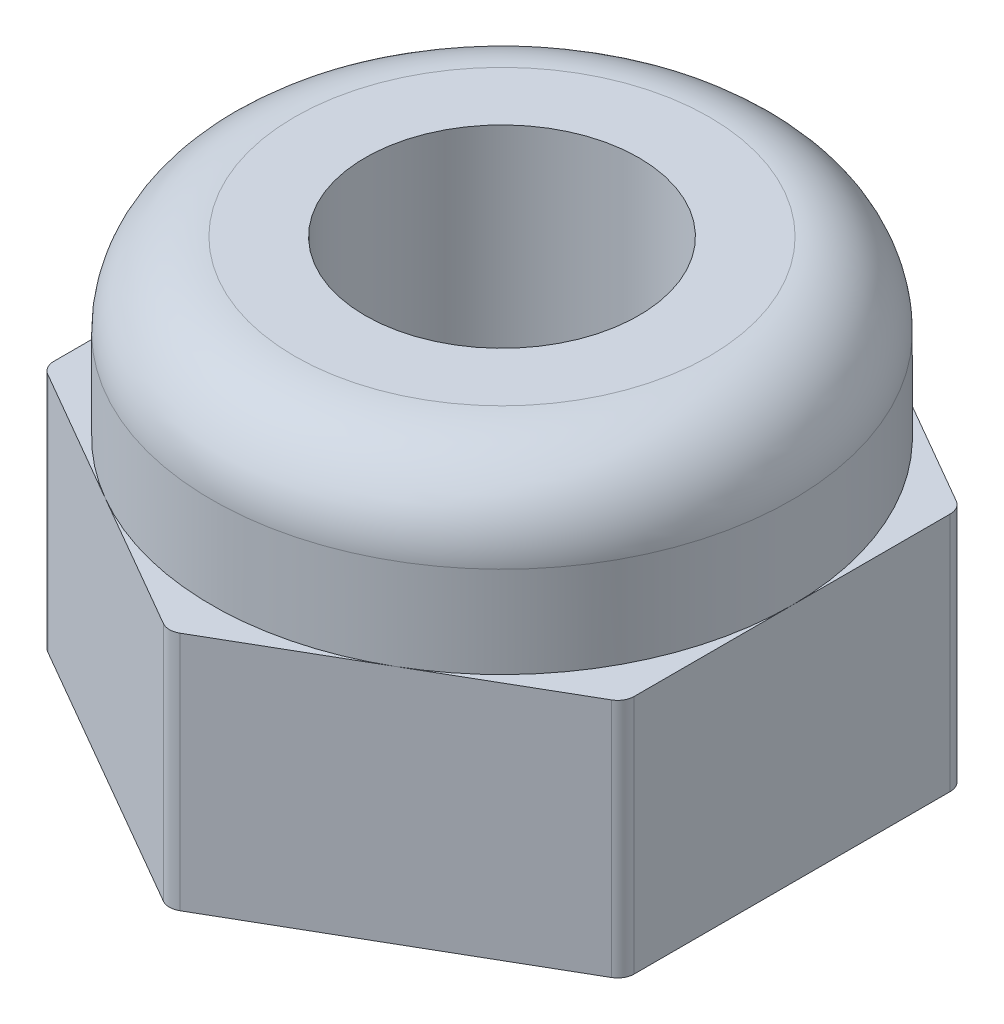
ISO-10303-21;
HEADER;
FILE_DESCRIPTION(('STEP AP214'),'2;1');
FILE_NAME('part.step','',(''),(''),'','','');
FILE_SCHEMA(('AUTOMOTIVE_DESIGN { 1 0 10303 214 1 1 1 1 }'));
ENDSEC;
DATA;
#1=APPLICATION_CONTEXT('core data for automotive mechanical design processes');
#2=APPLICATION_PROTOCOL_DEFINITION('international standard','automotive_design',2000,#1);
#3=PRODUCT_CONTEXT('',#1,'mechanical');
#4=PRODUCT('Part','Part','',(#3));
#5=PRODUCT_RELATED_PRODUCT_CATEGORY('part','',(#4));
#6=PRODUCT_DEFINITION_FORMATION('','',#4);
#7=PRODUCT_DEFINITION_CONTEXT('part definition',#1,'design');
#8=PRODUCT_DEFINITION('design','',#6,#7);
#9=PRODUCT_DEFINITION_SHAPE('','',#8);
#10=(LENGTH_UNIT() NAMED_UNIT(*) SI_UNIT(.MILLI.,.METRE.));
#11=(NAMED_UNIT(*) PLANE_ANGLE_UNIT() SI_UNIT($,.RADIAN.));
#12=(NAMED_UNIT(*) SI_UNIT($,.STERADIAN.) SOLID_ANGLE_UNIT());
#13=UNCERTAINTY_MEASURE_WITH_UNIT(LENGTH_MEASURE(1.E-05),#10,'distance_accuracy_value','');
#14=(GEOMETRIC_REPRESENTATION_CONTEXT(3) GLOBAL_UNCERTAINTY_ASSIGNED_CONTEXT((#13)) GLOBAL_UNIT_ASSIGNED_CONTEXT((#10,
#11,#12)) REPRESENTATION_CONTEXT('',''));
#15=CARTESIAN_POINT('',(0.,0.,0.));
#16=DIRECTION('',(0.,0.,1.));
#17=DIRECTION('',(1.,0.,0.));
#18=AXIS2_PLACEMENT_3D('',#15,#16,#17);
#19=CARTESIAN_POINT('',(0.,2.9,0.));
#20=DIRECTION('',(0.,1.,0.));
#21=DIRECTION('',(0.,0.,1.));
#22=AXIS2_PLACEMENT_3D('',#19,#20,#21);
#23=PLANE('',#22);
#24=DIRECTION('',(0.866025403784435,0.,-0.500000000000007));
#25=VECTOR('',#24,1.);
#26=CARTESIAN_POINT('',(0.,2.9,4.04145188432738));
#27=LINE('',#26,#25);
#28=CARTESIAN_POINT('',(1.75000000000002,2.9,3.03108891324552));
#29=VERTEX_POINT('',#28);
#30=CARTESIAN_POINT('',(3.40000000000002,2.9,2.07846096908262));
#31=VERTEX_POINT('',#30);
#32=EDGE_CURVE('E159',#29,#31,#27,.T.);
#33=ORIENTED_EDGE('',*,*,#32,.T.);
#34=CARTESIAN_POINT('',(3.30000000000002,2.9,1.90525588832574));
#35=DIRECTION('',(0.,1.,0.));
#36=DIRECTION('',(0.,0.,1.));
#37=AXIS2_PLACEMENT_3D('',#34,#35,#36);
#38=CIRCLE('',#37,0.2);
#39=CARTESIAN_POINT('',(3.50000000000002,2.9,1.90525588832573));
#40=VERTEX_POINT('',#39);
#41=EDGE_CURVE('E52',#31,#40,#38,.T.);
#42=ORIENTED_EDGE('',*,*,#41,.T.);
#43=DIRECTION('',(0.,0.,-1.));
#44=VECTOR('',#43,1.);
#45=CARTESIAN_POINT('',(3.50000000000002,2.9,2.02072594216366));
#46=LINE('',#45,#44);
#47=CARTESIAN_POINT('',(3.5,2.9,0.));
#48=VERTEX_POINT('',#47);
#49=EDGE_CURVE('E170',#40,#48,#46,.T.);
#50=ORIENTED_EDGE('',*,*,#49,.T.);
#51=CARTESIAN_POINT('',(0.,2.9,0.));
#52=DIRECTION('',(0.,1.,0.));
#53=DIRECTION('',(0.,0.,1.));
#54=AXIS2_PLACEMENT_3D('',#51,#52,#53);
#55=CIRCLE('',#54,3.50000000000002);
#56=EDGE_CURVE('E168',#29,#48,#55,.T.);
#57=ORIENTED_EDGE('',*,*,#56,.F.);
#58=EDGE_LOOP('',(#33,#42,#50,#57));
#59=FACE_BOUND('',#58,.T.);
#60=ADVANCED_FACE('F43',(#59),#23,.T.);
#61=CARTESIAN_POINT('',(3.49999999999998,2.9,-1.90525588832581));
#62=VERTEX_POINT('',#61);
#63=EDGE_CURVE('E158',#48,#62,#46,.T.);
#64=ORIENTED_EDGE('',*,*,#63,.T.);
#65=CARTESIAN_POINT('',(3.29999999999998,2.9,-1.90525588832581));
#66=DIRECTION('',(0.,1.,0.));
#67=DIRECTION('',(0.,0.,1.));
#68=AXIS2_PLACEMENT_3D('',#65,#66,#67);
#69=CIRCLE('',#68,0.2);
#70=CARTESIAN_POINT('',(3.39999999999998,2.9,-2.07846096908269));
#71=VERTEX_POINT('',#70);
#72=EDGE_CURVE('E302',#62,#71,#69,.T.);
#73=ORIENTED_EDGE('',*,*,#72,.T.);
#74=DIRECTION('',(-0.866025403784442,0.,-0.499999999999995));
#75=VECTOR('',#74,1.);
#76=CARTESIAN_POINT('',(3.49999999999998,2.9,-2.02072594216373));
#77=LINE('',#76,#75);
#78=CARTESIAN_POINT('',(1.74999999999999,2.9,-3.03108891324556));
#79=VERTEX_POINT('',#78);
#80=EDGE_CURVE('E193',#71,#79,#77,.T.);
#81=ORIENTED_EDGE('',*,*,#80,.T.);
#82=EDGE_CURVE('E176',#48,#79,#55,.T.);
#83=ORIENTED_EDGE('',*,*,#82,.F.);
#84=EDGE_LOOP('',(#64,#73,#81,#83));
#85=FACE_BOUND('',#84,.T.);
#86=ADVANCED_FACE('F366',(#85),#23,.T.);
#87=CARTESIAN_POINT('',(0.0999999999999994,2.9,-3.98371685740842));
#88=VERTEX_POINT('',#87);
#89=EDGE_CURVE('E197',#79,#88,#77,.T.);
#90=ORIENTED_EDGE('',*,*,#89,.T.);
#91=CARTESIAN_POINT('',(0.,2.9,-3.81051177665153));
#92=DIRECTION('',(0.,1.,0.));
#93=DIRECTION('',(0.,0.,1.));
#94=AXIS2_PLACEMENT_3D('',#91,#92,#93);
#95=CIRCLE('',#94,0.2);
#96=CARTESIAN_POINT('',(-0.0999999999999996,2.9,-3.98371685740842));
#97=VERTEX_POINT('',#96);
#98=EDGE_CURVE('E292',#88,#97,#95,.T.);
#99=ORIENTED_EDGE('',*,*,#98,.T.);
#100=DIRECTION('',(-0.866025403784438,0.,0.500000000000001));
#101=VECTOR('',#100,1.);
#102=CARTESIAN_POINT('',(0.,2.9,-4.04145188432738));
#103=LINE('',#102,#101);
#104=CARTESIAN_POINT('',(-1.75,2.9,-3.03108891324553));
#105=VERTEX_POINT('',#104);
#106=EDGE_CURVE('E198',#97,#105,#103,.T.);
#107=ORIENTED_EDGE('',*,*,#106,.T.);
#108=EDGE_CURVE('E374',#79,#105,#55,.T.);
#109=ORIENTED_EDGE('',*,*,#108,.F.);
#110=EDGE_LOOP('',(#90,#99,#107,#109));
#111=FACE_BOUND('',#110,.T.);
#112=ADVANCED_FACE('F390',(#111),#23,.T.);
#113=CARTESIAN_POINT('',(-3.40000000000001,2.9,-2.07846096908265));
#114=VERTEX_POINT('',#113);
#115=EDGE_CURVE('E196',#105,#114,#103,.T.);
#116=ORIENTED_EDGE('',*,*,#115,.T.);
#117=CARTESIAN_POINT('',(-3.30000000000001,2.9,-1.90525588832576));
#118=DIRECTION('',(0.,1.,0.));
#119=DIRECTION('',(0.,0.,1.));
#120=AXIS2_PLACEMENT_3D('',#117,#118,#119);
#121=CIRCLE('',#120,0.2);
#122=CARTESIAN_POINT('',(-3.50000000000001,2.9,-1.90525588832576));
#123=VERTEX_POINT('',#122);
#124=EDGE_CURVE('E282',#114,#123,#121,.T.);
#125=ORIENTED_EDGE('',*,*,#124,.T.);
#126=DIRECTION('',(0.,0.,1.));
#127=VECTOR('',#126,1.);
#128=CARTESIAN_POINT('',(-3.50000000000001,2.9,-2.02072594216368));
#129=LINE('',#128,#127);
#130=CARTESIAN_POINT('',(-3.5,2.9,0.));
#131=VERTEX_POINT('',#130);
#132=EDGE_CURVE('E202',#123,#131,#129,.T.);
#133=ORIENTED_EDGE('',*,*,#132,.T.);
#134=EDGE_CURVE('E187',#105,#131,#55,.T.);
#135=ORIENTED_EDGE('',*,*,#134,.F.);
#136=EDGE_LOOP('',(#116,#125,#133,#135));
#137=FACE_BOUND('',#136,.T.);
#138=ADVANCED_FACE('F380',(#137),#23,.T.);
#139=CARTESIAN_POINT('',(-3.49999999999999,2.9,1.90525588832578));
#140=VERTEX_POINT('',#139);
#141=EDGE_CURVE('E201',#131,#140,#129,.T.);
#142=ORIENTED_EDGE('',*,*,#141,.T.);
#143=CARTESIAN_POINT('',(-3.29999999999999,2.9,1.90525588832578));
#144=DIRECTION('',(0.,1.,0.));
#145=DIRECTION('',(0.,0.,1.));
#146=AXIS2_PLACEMENT_3D('',#143,#144,#145);
#147=CIRCLE('',#146,0.2);
#148=CARTESIAN_POINT('',(-3.39999999999999,2.9,2.07846096908267));
#149=VERTEX_POINT('',#148);
#150=EDGE_CURVE('E272',#140,#149,#147,.T.);
#151=ORIENTED_EDGE('',*,*,#150,.T.);
#152=DIRECTION('',(0.866025403784442,0.,0.499999999999995));
#153=VECTOR('',#152,1.);
#154=CARTESIAN_POINT('',(-3.49999999999999,2.9,2.02072594216371));
#155=LINE('',#154,#153);
#156=CARTESIAN_POINT('',(-1.74999999999998,2.9,3.03108891324554));
#157=VERTEX_POINT('',#156);
#158=EDGE_CURVE('E166',#149,#157,#155,.T.);
#159=ORIENTED_EDGE('',*,*,#158,.T.);
#160=EDGE_CURVE('E182',#131,#157,#55,.T.);
#161=ORIENTED_EDGE('',*,*,#160,.F.);
#162=EDGE_LOOP('',(#142,#151,#159,#161));
#163=FACE_BOUND('',#162,.T.);
#164=ADVANCED_FACE('F382',(#163),#23,.T.);
#165=CARTESIAN_POINT('',(3.49999999999998,2.9,-2.02072594216373));
#166=DIRECTION('',(-0.499999999999995,0.,0.866025403784442));
#167=DIRECTION('',(0.866025403784442,0.,0.499999999999995));
#168=AXIS2_PLACEMENT_3D('',#165,#166,#167);
#169=PLANE('',#168);
#170=DIRECTION('',(-0.866025403784442,0.,-0.499999999999995));
#171=VECTOR('',#170,1.);
#172=CARTESIAN_POINT('',(3.49999999999998,0.,-2.02072594216373));
#173=LINE('',#172,#171);
#174=CARTESIAN_POINT('',(3.39999999999998,0.,-2.07846096908269));
#175=VERTEX_POINT('',#174);
#176=CARTESIAN_POINT('',(0.0999999999999994,0.,-3.98371685740842));
#177=VERTEX_POINT('',#176);
#178=EDGE_CURVE('E175',#175,#177,#173,.T.);
#179=ORIENTED_EDGE('',*,*,#178,.T.);
#180=DIRECTION('',(0.,-1.,0.));
#181=VECTOR('',#180,1.);
#182=CARTESIAN_POINT('',(0.0999999999999994,2.9,-3.98371685740842));
#183=LINE('',#182,#181);
#184=EDGE_CURVE('E289',#177,#88,#183,.F.);
#185=ORIENTED_EDGE('',*,*,#184,.T.);
#186=ORIENTED_EDGE('',*,*,#89,.F.);
#187=ORIENTED_EDGE('',*,*,#80,.F.);
#188=DIRECTION('',(0.,-1.,0.));
#189=VECTOR('',#188,1.);
#190=CARTESIAN_POINT('',(3.39999999999998,2.9,-2.07846096908269));
#191=LINE('',#190,#189);
#192=EDGE_CURVE('E285',#71,#175,#191,.T.);
#193=ORIENTED_EDGE('',*,*,#192,.T.);
#194=EDGE_LOOP('',(#179,#185,#186,#187,#193));
#195=FACE_BOUND('',#194,.T.);
#196=ADVANCED_FACE('F356',(#195),#169,.F.);
#197=CARTESIAN_POINT('',(0.,2.9,-4.04145188432738));
#198=DIRECTION('',(0.500000000000001,0.,0.866025403784438));
#199=DIRECTION('',(0.866025403784438,0.,-0.500000000000001));
#200=AXIS2_PLACEMENT_3D('',#197,#198,#199);
#201=PLANE('',#200);
#202=DIRECTION('',(-0.866025403784438,0.,0.500000000000001));
#203=VECTOR('',#202,1.);
#204=CARTESIAN_POINT('',(0.,0.,-4.04145188432738));
#205=LINE('',#204,#203);
#206=CARTESIAN_POINT('',(-0.0999999999999996,0.,-3.98371685740842));
#207=VERTEX_POINT('',#206);
#208=CARTESIAN_POINT('',(-3.40000000000001,0.,-2.07846096908265));
#209=VERTEX_POINT('',#208);
#210=EDGE_CURVE('E214',#207,#209,#205,.T.);
#211=ORIENTED_EDGE('',*,*,#210,.T.);
#212=DIRECTION('',(0.,-1.,0.));
#213=VECTOR('',#212,1.);
#214=CARTESIAN_POINT('',(-3.40000000000001,2.9,-2.07846096908265));
#215=LINE('',#214,#213);
#216=EDGE_CURVE('E279',#209,#114,#215,.F.);
#217=ORIENTED_EDGE('',*,*,#216,.T.);
#218=ORIENTED_EDGE('',*,*,#115,.F.);
#219=ORIENTED_EDGE('',*,*,#106,.F.);
#220=DIRECTION('',(0.,-1.,0.));
#221=VECTOR('',#220,1.);
#222=CARTESIAN_POINT('',(-0.0999999999999996,2.9,-3.98371685740842));
#223=LINE('',#222,#221);
#224=EDGE_CURVE('E275',#97,#207,#223,.T.);
#225=ORIENTED_EDGE('',*,*,#224,.T.);
#226=EDGE_LOOP('',(#211,#217,#218,#219,#225));
#227=FACE_BOUND('',#226,.T.);
#228=ADVANCED_FACE('F345',(#227),#201,.F.);
#229=CARTESIAN_POINT('',(-3.50000000000001,2.9,-2.02072594216368));
#230=DIRECTION('',(1.,0.,0.));
#231=DIRECTION('',(0.,0.,-1.));
#232=AXIS2_PLACEMENT_3D('',#229,#230,#231);
#233=PLANE('',#232);
#234=DIRECTION('',(0.,0.,1.));
#235=VECTOR('',#234,1.);
#236=CARTESIAN_POINT('',(-3.50000000000001,0.,-2.02072594216368));
#237=LINE('',#236,#235);
#238=CARTESIAN_POINT('',(-3.50000000000001,0.,-1.90525588832576));
#239=VERTEX_POINT('',#238);
#240=CARTESIAN_POINT('',(-3.49999999999999,0.,1.90525588832578));
#241=VERTEX_POINT('',#240);
#242=EDGE_CURVE('E218',#239,#241,#237,.T.);
#243=ORIENTED_EDGE('',*,*,#242,.T.);
#244=DIRECTION('',(0.,-1.,0.));
#245=VECTOR('',#244,1.);
#246=CARTESIAN_POINT('',(-3.49999999999999,2.9,1.90525588832578));
#247=LINE('',#246,#245);
#248=EDGE_CURVE('E269',#241,#140,#247,.F.);
#249=ORIENTED_EDGE('',*,*,#248,.T.);
#250=ORIENTED_EDGE('',*,*,#141,.F.);
#251=ORIENTED_EDGE('',*,*,#132,.F.);
#252=DIRECTION('',(0.,-1.,0.));
#253=VECTOR('',#252,1.);
#254=CARTESIAN_POINT('',(-3.50000000000001,2.9,-1.90525588832576));
#255=LINE('',#254,#253);
#256=EDGE_CURVE('E265',#123,#239,#255,.T.);
#257=ORIENTED_EDGE('',*,*,#256,.T.);
#258=EDGE_LOOP('',(#243,#249,#250,#251,#257));
#259=FACE_BOUND('',#258,.T.);
#260=ADVANCED_FACE('F334',(#259),#233,.F.);
#261=CARTESIAN_POINT('',(-3.49999999999999,2.9,2.02072594216371));
#262=DIRECTION('',(0.499999999999995,0.,-0.866025403784442));
#263=DIRECTION('',(-0.866025403784442,0.,-0.499999999999995));
#264=AXIS2_PLACEMENT_3D('',#261,#262,#263);
#265=PLANE('',#264);
#266=ORIENTED_EDGE('',*,*,#158,.F.);
#267=DIRECTION('',(0.,-1.,0.));
#268=VECTOR('',#267,1.);
#269=CARTESIAN_POINT('',(-3.39999999999999,2.9,2.07846096908267));
#270=LINE('',#269,#268);
#271=CARTESIAN_POINT('',(-3.39999999999999,0.,2.07846096908267));
#272=VERTEX_POINT('',#271);
#273=EDGE_CURVE('E243',#149,#272,#270,.T.);
#274=ORIENTED_EDGE('',*,*,#273,.T.);
#275=DIRECTION('',(0.866025403784442,0.,0.499999999999995));
#276=VECTOR('',#275,1.);
#277=CARTESIAN_POINT('',(-3.49999999999999,0.,2.02072594216371));
#278=LINE('',#277,#276);
#279=CARTESIAN_POINT('',(-0.0999999999999734,0.,3.98371685740842));
#280=VERTEX_POINT('',#279);
#281=EDGE_CURVE('E222',#272,#280,#278,.T.);
#282=ORIENTED_EDGE('',*,*,#281,.T.);
#283=DIRECTION('',(0.,-1.,0.));
#284=VECTOR('',#283,1.);
#285=CARTESIAN_POINT('',(-0.0999999999999721,2.9,3.98371685740842));
#286=LINE('',#285,#284);
#287=CARTESIAN_POINT('',(-0.0999999999999734,2.9,3.98371685740842));
#288=VERTEX_POINT('',#287);
#289=EDGE_CURVE('E240',#280,#288,#286,.F.);
#290=ORIENTED_EDGE('',*,*,#289,.T.);
#291=EDGE_CURVE('E205',#157,#288,#155,.T.);
#292=ORIENTED_EDGE('',*,*,#291,.F.);
#293=EDGE_LOOP('',(#266,#274,#282,#290,#292));
#294=FACE_BOUND('',#293,.T.);
#295=ADVANCED_FACE('F326',(#294),#265,.F.);
#296=CARTESIAN_POINT('',(0.,2.9,4.04145188432738));
#297=DIRECTION('',(-0.500000000000007,0.,-0.866025403784435));
#298=DIRECTION('',(-0.866025403784435,0.,0.500000000000007));
#299=AXIS2_PLACEMENT_3D('',#296,#297,#298);
#300=PLANE('',#299);
#301=DIRECTION('',(0.866025403784435,0.,-0.500000000000007));
#302=VECTOR('',#301,1.);
#303=CARTESIAN_POINT('',(0.,0.,4.04145188432738));
#304=LINE('',#303,#302);
#305=CARTESIAN_POINT('',(0.100000000000028,0.,3.98371685740842));
#306=VERTEX_POINT('',#305);
#307=CARTESIAN_POINT('',(3.40000000000002,0.,2.07846096908262));
#308=VERTEX_POINT('',#307);
#309=EDGE_CURVE('E226',#306,#308,#304,.T.);
#310=ORIENTED_EDGE('',*,*,#309,.T.);
#311=DIRECTION('',(0.,-1.,0.));
#312=VECTOR('',#311,1.);
#313=CARTESIAN_POINT('',(3.40000000000002,2.9,2.07846096908262));
#314=LINE('',#313,#312);
#315=EDGE_CURVE('E65',#308,#31,#314,.F.);
#316=ORIENTED_EDGE('',*,*,#315,.T.);
#317=ORIENTED_EDGE('',*,*,#32,.F.);
#318=CARTESIAN_POINT('',(0.100000000000028,2.9,3.98371685740842));
#319=VERTEX_POINT('',#318);
#320=EDGE_CURVE('E150',#319,#29,#27,.T.);
#321=ORIENTED_EDGE('',*,*,#320,.F.);
#322=DIRECTION('',(0.,-1.,0.));
#323=VECTOR('',#322,1.);
#324=CARTESIAN_POINT('',(0.100000000000028,2.9,3.98371685740842));
#325=LINE('',#324,#323);
#326=EDGE_CURVE('E305',#319,#306,#325,.T.);
#327=ORIENTED_EDGE('',*,*,#326,.T.);
#328=EDGE_LOOP('',(#310,#316,#317,#321,#327));
#329=FACE_BOUND('',#328,.T.);
#330=ADVANCED_FACE('F162',(#329),#300,.F.);
#331=CARTESIAN_POINT('',(3.50000000000002,2.9,2.02072594216366));
#332=DIRECTION('',(-1.,0.,0.));
#333=DIRECTION('',(0.,0.,1.));
#334=AXIS2_PLACEMENT_3D('',#331,#332,#333);
#335=PLANE('',#334);
#336=DIRECTION('',(0.,0.,-1.));
#337=VECTOR('',#336,1.);
#338=CARTESIAN_POINT('',(3.50000000000002,0.,2.02072594216366));
#339=LINE('',#338,#337);
#340=CARTESIAN_POINT('',(3.50000000000002,0.,1.90525588832573));
#341=VERTEX_POINT('',#340);
#342=CARTESIAN_POINT('',(3.49999999999998,0.,-1.90525588832581));
#343=VERTEX_POINT('',#342);
#344=EDGE_CURVE('E229',#341,#343,#339,.T.);
#345=ORIENTED_EDGE('',*,*,#344,.T.);
#346=DIRECTION('',(0.,-1.,0.));
#347=VECTOR('',#346,1.);
#348=CARTESIAN_POINT('',(3.49999999999998,2.9,-1.90525588832581));
#349=LINE('',#348,#347);
#350=EDGE_CURVE('E299',#343,#62,#349,.F.);
#351=ORIENTED_EDGE('',*,*,#350,.T.);
#352=ORIENTED_EDGE('',*,*,#63,.F.);
#353=ORIENTED_EDGE('',*,*,#49,.F.);
#354=DIRECTION('',(0.,-1.,0.));
#355=VECTOR('',#354,1.);
#356=CARTESIAN_POINT('',(3.50000000000002,2.9,1.90525588832573));
#357=LINE('',#356,#355);
#358=EDGE_CURVE('E295',#40,#341,#357,.T.);
#359=ORIENTED_EDGE('',*,*,#358,.T.);
#360=EDGE_LOOP('',(#345,#351,#352,#353,#359));
#361=FACE_BOUND('',#360,.T.);
#362=ADVANCED_FACE('F314',(#361),#335,.F.);
#363=ORIENTED_EDGE('',*,*,#291,.T.);
#364=CARTESIAN_POINT('',(0.,2.9,3.81051177665153));
#365=DIRECTION('',(0.,1.,0.));
#366=DIRECTION('',(0.,0.,1.));
#367=AXIS2_PLACEMENT_3D('',#364,#365,#366);
#368=CIRCLE('',#367,0.2);
#369=EDGE_CURVE('E11',#288,#319,#368,.T.);
#370=ORIENTED_EDGE('',*,*,#369,.T.);
#371=ORIENTED_EDGE('',*,*,#320,.T.);
#372=EDGE_CURVE('E153',#157,#29,#55,.T.);
#373=ORIENTED_EDGE('',*,*,#372,.F.);
#374=EDGE_LOOP('',(#363,#370,#371,#373));
#375=FACE_BOUND('',#374,.T.);
#376=ADVANCED_FACE('F151',(#375),#23,.T.);
#377=CARTESIAN_POINT('',(0.,0.,0.));
#378=DIRECTION('',(0.,1.,0.));
#379=DIRECTION('',(0.,0.,1.));
#380=AXIS2_PLACEMENT_3D('',#377,#378,#379);
#381=PLANE('',#380);
#382=CARTESIAN_POINT('',(0.,0.,0.));
#383=DIRECTION('',(0.,-1.,0.));
#384=DIRECTION('',(0.,0.,-1.));
#385=AXIS2_PLACEMENT_3D('',#382,#383,#384);
#386=CIRCLE('',#385,1.65);
#387=CARTESIAN_POINT('',(0.,0.,-1.65));
#388=VERTEX_POINT('',#387);
#389=EDGE_CURVE('E189',#388,#388,#386,.T.);
#390=ORIENTED_EDGE('',*,*,#389,.F.);
#391=EDGE_LOOP('',(#390));
#392=FACE_BOUND('',#391,.T.);
#393=ORIENTED_EDGE('',*,*,#281,.F.);
#394=CARTESIAN_POINT('',(-3.29999999999999,0.,1.90525588832578));
#395=DIRECTION('',(0.,1.,0.));
#396=DIRECTION('',(0.,0.,1.));
#397=AXIS2_PLACEMENT_3D('',#394,#395,#396);
#398=CIRCLE('',#397,0.2);
#399=EDGE_CURVE('E262',#272,#241,#398,.F.);
#400=ORIENTED_EDGE('',*,*,#399,.T.);
#401=ORIENTED_EDGE('',*,*,#242,.F.);
#402=CARTESIAN_POINT('',(-3.30000000000001,0.,-1.90525588832576));
#403=DIRECTION('',(0.,1.,0.));
#404=DIRECTION('',(0.,0.,1.));
#405=AXIS2_PLACEMENT_3D('',#402,#403,#404);
#406=CIRCLE('',#405,0.2);
#407=EDGE_CURVE('E259',#239,#209,#406,.F.);
#408=ORIENTED_EDGE('',*,*,#407,.T.);
#409=ORIENTED_EDGE('',*,*,#210,.F.);
#410=CARTESIAN_POINT('',(0.,0.,-3.81051177665153));
#411=DIRECTION('',(0.,1.,0.));
#412=DIRECTION('',(0.,0.,1.));
#413=AXIS2_PLACEMENT_3D('',#410,#411,#412);
#414=CIRCLE('',#413,0.2);
#415=EDGE_CURVE('E256',#207,#177,#414,.F.);
#416=ORIENTED_EDGE('',*,*,#415,.T.);
#417=ORIENTED_EDGE('',*,*,#178,.F.);
#418=CARTESIAN_POINT('',(3.29999999999998,0.,-1.90525588832581));
#419=DIRECTION('',(0.,1.,0.));
#420=DIRECTION('',(0.,0.,1.));
#421=AXIS2_PLACEMENT_3D('',#418,#419,#420);
#422=CIRCLE('',#421,0.2);
#423=EDGE_CURVE('E253',#175,#343,#422,.F.);
#424=ORIENTED_EDGE('',*,*,#423,.T.);
#425=ORIENTED_EDGE('',*,*,#344,.F.);
#426=CARTESIAN_POINT('',(3.30000000000002,0.,1.90525588832574));
#427=DIRECTION('',(0.,1.,0.));
#428=DIRECTION('',(0.,0.,1.));
#429=AXIS2_PLACEMENT_3D('',#426,#427,#428);
#430=CIRCLE('',#429,0.2);
#431=EDGE_CURVE('E250',#341,#308,#430,.F.);
#432=ORIENTED_EDGE('',*,*,#431,.T.);
#433=ORIENTED_EDGE('',*,*,#309,.F.);
#434=CARTESIAN_POINT('',(0.,0.,3.81051177665153));
#435=DIRECTION('',(0.,1.,0.));
#436=DIRECTION('',(0.,0.,1.));
#437=AXIS2_PLACEMENT_3D('',#434,#435,#436);
#438=CIRCLE('',#437,0.2);
#439=EDGE_CURVE('E247',#306,#280,#438,.F.);
#440=ORIENTED_EDGE('',*,*,#439,.T.);
#441=EDGE_LOOP('',(#393,#400,#401,#408,#409,#416,#417,#424,#425,#432,#433,#440));
#442=FACE_BOUND('',#441,.T.);
#443=ADVANCED_FACE('F321',(#392,#442),#381,.F.);
#444=CARTESIAN_POINT('',(0.,5.,0.));
#445=DIRECTION('',(0.,-1.,0.));
#446=DIRECTION('',(0.,0.,-1.));
#447=AXIS2_PLACEMENT_3D('',#444,#445,#446);
#448=CYLINDRICAL_SURFACE('',#447,3.50000000000002);
#449=CARTESIAN_POINT('',(0.,4.,0.));
#450=DIRECTION('',(0.,-1.,0.));
#451=DIRECTION('',(0.,0.,-1.));
#452=AXIS2_PLACEMENT_3D('',#449,#450,#451);
#453=CIRCLE('',#452,3.50000000000002);
#454=CARTESIAN_POINT('',(0.,4.,-3.50000000000002));
#455=VERTEX_POINT('',#454);
#456=EDGE_CURVE('E210',#455,#455,#453,.T.);
#457=ORIENTED_EDGE('',*,*,#456,.T.);
#458=EDGE_LOOP('',(#457));
#459=FACE_BOUND('',#458,.T.);
#460=ORIENTED_EDGE('',*,*,#372,.T.);
#461=ORIENTED_EDGE('',*,*,#56,.T.);
#462=ORIENTED_EDGE('',*,*,#82,.T.);
#463=ORIENTED_EDGE('',*,*,#108,.T.);
#464=ORIENTED_EDGE('',*,*,#134,.T.);
#465=ORIENTED_EDGE('',*,*,#160,.T.);
#466=EDGE_LOOP('',(#460,#461,#462,#463,#464,#465));
#467=FACE_BOUND('',#466,.T.);
#468=ADVANCED_FACE('F179',(#459,#467),#448,.T.);
#469=CARTESIAN_POINT('',(0.,5.,0.));
#470=DIRECTION('',(0.,-1.,0.));
#471=DIRECTION('',(0.,0.,-1.));
#472=AXIS2_PLACEMENT_3D('',#469,#470,#471);
#473=PLANE('',#472);
#474=CARTESIAN_POINT('',(0.,5.,0.));
#475=DIRECTION('',(0.,-1.,0.));
#476=DIRECTION('',(0.,0.,-1.));
#477=AXIS2_PLACEMENT_3D('',#474,#475,#476);
#478=CIRCLE('',#477,1.65);
#479=CARTESIAN_POINT('',(0.,5.,-1.65));
#480=VERTEX_POINT('',#479);
#481=EDGE_CURVE('E184',#480,#480,#478,.T.);
#482=ORIENTED_EDGE('',*,*,#481,.T.);
#483=EDGE_LOOP('',(#482));
#484=FACE_BOUND('',#483,.T.);
#485=CARTESIAN_POINT('',(0.,5.,0.));
#486=DIRECTION('',(0.,-1.,0.));
#487=DIRECTION('',(0.,0.,-1.));
#488=AXIS2_PLACEMENT_3D('',#485,#486,#487);
#489=CIRCLE('',#488,2.50000000000002);
#490=CARTESIAN_POINT('',(0.,5.,-2.50000000000002));
#491=VERTEX_POINT('',#490);
#492=EDGE_CURVE('E236',#491,#491,#489,.F.);
#493=ORIENTED_EDGE('',*,*,#492,.T.);
#494=EDGE_LOOP('',(#493));
#495=FACE_BOUND('',#494,.T.);
#496=ADVANCED_FACE('F532',(#484,#495),#473,.F.);
#497=CARTESIAN_POINT('',(0.,4.,0.));
#498=DIRECTION('',(0.,-1.,0.));
#499=DIRECTION('',(0.,0.,-1.));
#500=AXIS2_PLACEMENT_3D('',#497,#498,#499);
#501=TOROIDAL_SURFACE('',#500,2.50000000000002,1.);
#502=ORIENTED_EDGE('',*,*,#492,.F.);
#503=EDGE_LOOP('',(#502));
#504=FACE_BOUND('',#503,.T.);
#505=ORIENTED_EDGE('',*,*,#456,.F.);
#506=EDGE_LOOP('',(#505));
#507=FACE_BOUND('',#506,.T.);
#508=ADVANCED_FACE('F475',(#504,#507),#501,.T.);
#509=CARTESIAN_POINT('',(-3.29999999999999,2.9,1.90525588832578));
#510=DIRECTION('',(0.,-1.,0.));
#511=DIRECTION('',(0.,0.,-1.));
#512=AXIS2_PLACEMENT_3D('',#509,#510,#511);
#513=CYLINDRICAL_SURFACE('',#512,0.2);
#514=ORIENTED_EDGE('',*,*,#150,.F.);
#515=ORIENTED_EDGE('',*,*,#248,.F.);
#516=ORIENTED_EDGE('',*,*,#399,.F.);
#517=ORIENTED_EDGE('',*,*,#273,.F.);
#518=EDGE_LOOP('',(#514,#515,#516,#517));
#519=FACE_BOUND('',#518,.T.);
#520=ADVANCED_FACE('F330',(#519),#513,.T.);
#521=CARTESIAN_POINT('',(-3.30000000000001,2.9,-1.90525588832576));
#522=DIRECTION('',(0.,-1.,0.));
#523=DIRECTION('',(0.,0.,-1.));
#524=AXIS2_PLACEMENT_3D('',#521,#522,#523);
#525=CYLINDRICAL_SURFACE('',#524,0.2);
#526=ORIENTED_EDGE('',*,*,#124,.F.);
#527=ORIENTED_EDGE('',*,*,#216,.F.);
#528=ORIENTED_EDGE('',*,*,#407,.F.);
#529=ORIENTED_EDGE('',*,*,#256,.F.);
#530=EDGE_LOOP('',(#526,#527,#528,#529));
#531=FACE_BOUND('',#530,.T.);
#532=ADVANCED_FACE('F341',(#531),#525,.T.);
#533=CARTESIAN_POINT('',(0.,2.9,-3.81051177665153));
#534=DIRECTION('',(0.,-1.,0.));
#535=DIRECTION('',(0.,0.,-1.));
#536=AXIS2_PLACEMENT_3D('',#533,#534,#535);
#537=CYLINDRICAL_SURFACE('',#536,0.2);
#538=ORIENTED_EDGE('',*,*,#98,.F.);
#539=ORIENTED_EDGE('',*,*,#184,.F.);
#540=ORIENTED_EDGE('',*,*,#415,.F.);
#541=ORIENTED_EDGE('',*,*,#224,.F.);
#542=EDGE_LOOP('',(#538,#539,#540,#541));
#543=FACE_BOUND('',#542,.T.);
#544=ADVANCED_FACE('F352',(#543),#537,.T.);
#545=CARTESIAN_POINT('',(3.29999999999998,2.9,-1.90525588832581));
#546=DIRECTION('',(0.,-1.,0.));
#547=DIRECTION('',(0.,0.,-1.));
#548=AXIS2_PLACEMENT_3D('',#545,#546,#547);
#549=CYLINDRICAL_SURFACE('',#548,0.2);
#550=ORIENTED_EDGE('',*,*,#72,.F.);
#551=ORIENTED_EDGE('',*,*,#350,.F.);
#552=ORIENTED_EDGE('',*,*,#423,.F.);
#553=ORIENTED_EDGE('',*,*,#192,.F.);
#554=EDGE_LOOP('',(#550,#551,#552,#553));
#555=FACE_BOUND('',#554,.T.);
#556=ADVANCED_FACE('F363',(#555),#549,.T.);
#557=CARTESIAN_POINT('',(3.30000000000002,2.9,1.90525588832574));
#558=DIRECTION('',(0.,-1.,0.));
#559=DIRECTION('',(0.,0.,-1.));
#560=AXIS2_PLACEMENT_3D('',#557,#558,#559);
#561=CYLINDRICAL_SURFACE('',#560,0.2);
#562=ORIENTED_EDGE('',*,*,#41,.F.);
#563=ORIENTED_EDGE('',*,*,#315,.F.);
#564=ORIENTED_EDGE('',*,*,#431,.F.);
#565=ORIENTED_EDGE('',*,*,#358,.F.);
#566=EDGE_LOOP('',(#562,#563,#564,#565));
#567=FACE_BOUND('',#566,.T.);
#568=ADVANCED_FACE('F317',(#567),#561,.T.);
#569=CARTESIAN_POINT('',(0.,2.9,3.81051177665153));
#570=DIRECTION('',(0.,-1.,0.));
#571=DIRECTION('',(0.,0.,-1.));
#572=AXIS2_PLACEMENT_3D('',#569,#570,#571);
#573=CYLINDRICAL_SURFACE('',#572,0.2);
#574=ORIENTED_EDGE('',*,*,#369,.F.);
#575=ORIENTED_EDGE('',*,*,#289,.F.);
#576=ORIENTED_EDGE('',*,*,#439,.F.);
#577=ORIENTED_EDGE('',*,*,#326,.F.);
#578=EDGE_LOOP('',(#574,#575,#576,#577));
#579=FACE_BOUND('',#578,.T.);
#580=ADVANCED_FACE('F45',(#579),#573,.T.);
#581=CARTESIAN_POINT('',(0.,0.,0.));
#582=DIRECTION('',(0.,-1.,0.));
#583=DIRECTION('',(0.,0.,-1.));
#584=AXIS2_PLACEMENT_3D('',#581,#582,#583);
#585=CYLINDRICAL_SURFACE('',#584,1.65);
#586=ORIENTED_EDGE('',*,*,#389,.T.);
#587=EDGE_LOOP('',(#586));
#588=FACE_BOUND('',#587,.T.);
#589=ORIENTED_EDGE('',*,*,#481,.F.);
#590=EDGE_LOOP('',(#589));
#591=FACE_BOUND('',#590,.T.);
#592=ADVANCED_FACE('F517',(#588,#591),#585,.F.);
#593=CLOSED_SHELL('',(#60,#86,#112,#138,#164,#196,#228,#260,#295,#330,#362,#376,#443,#468,#496,
#508,#520,#532,#544,#556,#568,#580,#592));
#594=MANIFOLD_SOLID_BREP('B2',#593);
#595=ADVANCED_BREP_SHAPE_REPRESENTATION('',(#18,#594),#14);
#596=SHAPE_DEFINITION_REPRESENTATION(#9,#595);
ENDSEC;
END-ISO-10303-21;
